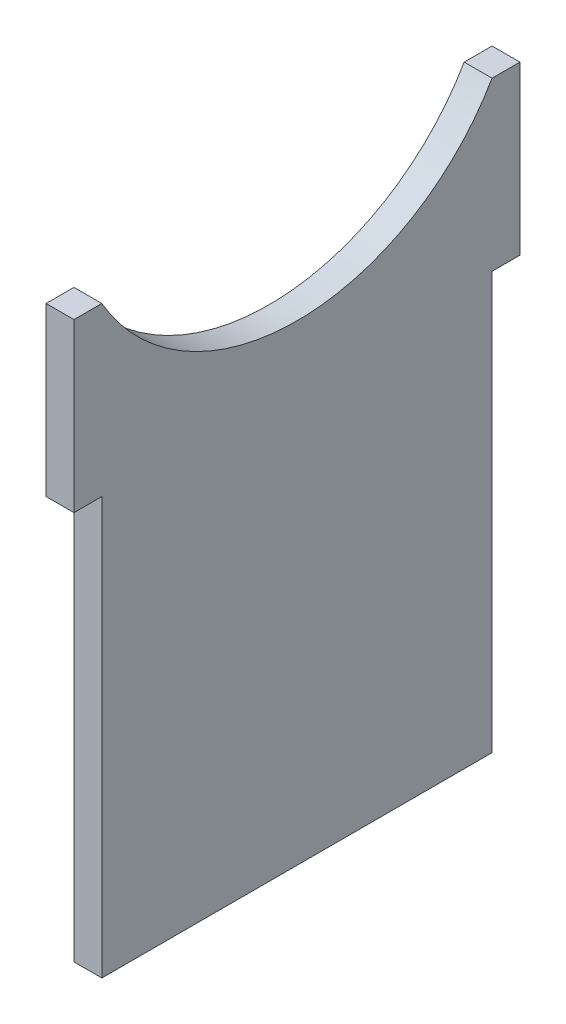
ISO-10303-21;
HEADER;
FILE_DESCRIPTION(('STEP AP214'),'2;1');
FILE_NAME('part.step','',(''),(''),'','','');
FILE_SCHEMA(('AUTOMOTIVE_DESIGN { 1 0 10303 214 1 1 1 1 }'));
ENDSEC;
DATA;
#1=APPLICATION_CONTEXT('core data for automotive mechanical design processes');
#2=APPLICATION_PROTOCOL_DEFINITION('international standard','automotive_design',2000,#1);
#3=PRODUCT_CONTEXT('',#1,'mechanical');
#4=PRODUCT('Part','Part','',(#3));
#5=PRODUCT_RELATED_PRODUCT_CATEGORY('part','',(#4));
#6=PRODUCT_DEFINITION_FORMATION('','',#4);
#7=PRODUCT_DEFINITION_CONTEXT('part definition',#1,'design');
#8=PRODUCT_DEFINITION('design','',#6,#7);
#9=PRODUCT_DEFINITION_SHAPE('','',#8);
#10=(LENGTH_UNIT() NAMED_UNIT(*) SI_UNIT(.MILLI.,.METRE.));
#11=(NAMED_UNIT(*) PLANE_ANGLE_UNIT() SI_UNIT($,.RADIAN.));
#12=(NAMED_UNIT(*) SI_UNIT($,.STERADIAN.) SOLID_ANGLE_UNIT());
#13=UNCERTAINTY_MEASURE_WITH_UNIT(LENGTH_MEASURE(1.E-05),#10,'distance_accuracy_value','');
#14=(GEOMETRIC_REPRESENTATION_CONTEXT(3) GLOBAL_UNCERTAINTY_ASSIGNED_CONTEXT((#13)) GLOBAL_UNIT_ASSIGNED_CONTEXT((#10,
#11,#12)) REPRESENTATION_CONTEXT('',''));
#15=CARTESIAN_POINT('',(0.,0.,0.));
#16=DIRECTION('',(0.,0.,1.));
#17=DIRECTION('',(1.,0.,0.));
#18=AXIS2_PLACEMENT_3D('',#15,#16,#17);
#19=CARTESIAN_POINT('',(1.5875,0.,0.));
#20=DIRECTION('',(-1.,0.,0.));
#21=DIRECTION('',(0.,0.,1.));
#22=AXIS2_PLACEMENT_3D('',#19,#20,#21);
#23=CYLINDRICAL_SURFACE('',#22,12.8316097327394);
#24=CARTESIAN_POINT('',(0.,0.,0.));
#25=DIRECTION('',(1.,0.,0.));
#26=DIRECTION('',(0.,0.,-1.));
#27=AXIS2_PLACEMENT_3D('',#24,#25,#26);
#28=CIRCLE('',#27,12.8316097327394);
#29=CARTESIAN_POINT('',(0.,-6.41580486636971,11.1125));
#30=VERTEX_POINT('',#29);
#31=CARTESIAN_POINT('',(0.,-6.41580486636971,-11.1125));
#32=VERTEX_POINT('',#31);
#33=EDGE_CURVE('E142',#30,#32,#28,.T.);
#34=ORIENTED_EDGE('',*,*,#33,.F.);
#35=DIRECTION('',(-1.,0.,0.));
#36=VECTOR('',#35,1.);
#37=CARTESIAN_POINT('',(1.5875,-6.41580486636971,11.1125));
#38=LINE('',#37,#36);
#39=CARTESIAN_POINT('',(1.5875,-6.41580486636971,11.1125));
#40=VERTEX_POINT('',#39);
#41=EDGE_CURVE('E11',#40,#30,#38,.T.);
#42=ORIENTED_EDGE('',*,*,#41,.F.);
#43=CARTESIAN_POINT('',(1.5875,0.,0.));
#44=DIRECTION('',(1.,0.,0.));
#45=DIRECTION('',(0.,0.,-1.));
#46=AXIS2_PLACEMENT_3D('',#43,#44,#45);
#47=CIRCLE('',#46,12.8316097327394);
#48=CARTESIAN_POINT('',(1.5875,-6.41580486636971,-11.1125));
#49=VERTEX_POINT('',#48);
#50=EDGE_CURVE('E164',#40,#49,#47,.T.);
#51=ORIENTED_EDGE('',*,*,#50,.T.);
#52=DIRECTION('',(-1.,0.,0.));
#53=VECTOR('',#52,1.);
#54=CARTESIAN_POINT('',(1.5875,-6.41580486636971,-11.1125));
#55=LINE('',#54,#53);
#56=EDGE_CURVE('E52',#49,#32,#55,.T.);
#57=ORIENTED_EDGE('',*,*,#56,.T.);
#58=EDGE_LOOP('',(#34,#42,#51,#57));
#59=FACE_BOUND('',#58,.T.);
#60=ADVANCED_FACE('F36',(#59),#23,.F.);
#61=CARTESIAN_POINT('',(1.5875,-6.41580486636971,0.));
#62=DIRECTION('',(0.,-1.,0.));
#63=DIRECTION('',(0.,0.,-1.));
#64=AXIS2_PLACEMENT_3D('',#61,#62,#63);
#65=PLANE('',#64);
#66=DIRECTION('',(0.,0.,1.));
#67=VECTOR('',#66,1.);
#68=CARTESIAN_POINT('',(0.,-6.41580486636971,0.));
#69=LINE('',#68,#67);
#70=CARTESIAN_POINT('',(0.,-6.41580486636971,12.7));
#71=VERTEX_POINT('',#70);
#72=EDGE_CURVE('E144',#30,#71,#69,.T.);
#73=ORIENTED_EDGE('',*,*,#72,.T.);
#74=DIRECTION('',(-1.,0.,0.));
#75=VECTOR('',#74,1.);
#76=CARTESIAN_POINT('',(1.5875,-6.41580486636971,12.7));
#77=LINE('',#76,#75);
#78=CARTESIAN_POINT('',(1.5875,-6.41580486636971,12.7));
#79=VERTEX_POINT('',#78);
#80=EDGE_CURVE('E44',#79,#71,#77,.T.);
#81=ORIENTED_EDGE('',*,*,#80,.F.);
#82=DIRECTION('',(0.,0.,1.));
#83=VECTOR('',#82,1.);
#84=CARTESIAN_POINT('',(1.5875,-6.41580486636971,0.));
#85=LINE('',#84,#83);
#86=EDGE_CURVE('E202',#40,#79,#85,.T.);
#87=ORIENTED_EDGE('',*,*,#86,.F.);
#88=ORIENTED_EDGE('',*,*,#41,.T.);
#89=EDGE_LOOP('',(#73,#81,#87,#88));
#90=FACE_BOUND('',#89,.T.);
#91=ADVANCED_FACE('F225',(#90),#65,.F.);
#92=CARTESIAN_POINT('',(1.5875,0.,12.7));
#93=DIRECTION('',(0.,0.,-1.));
#94=DIRECTION('',(0.,1.,0.));
#95=AXIS2_PLACEMENT_3D('',#92,#93,#94);
#96=PLANE('',#95);
#97=DIRECTION('',(0.,-1.,0.));
#98=VECTOR('',#97,1.);
#99=CARTESIAN_POINT('',(0.,0.,12.7));
#100=LINE('',#99,#98);
#101=CARTESIAN_POINT('',(0.,-15.9408048663697,12.7));
#102=VERTEX_POINT('',#101);
#103=EDGE_CURVE('E146',#71,#102,#100,.T.);
#104=ORIENTED_EDGE('',*,*,#103,.T.);
#105=DIRECTION('',(-1.,0.,0.));
#106=VECTOR('',#105,1.);
#107=CARTESIAN_POINT('',(1.5875,-15.9408048663697,12.7));
#108=LINE('',#107,#106);
#109=CARTESIAN_POINT('',(1.5875,-15.9408048663697,12.7));
#110=VERTEX_POINT('',#109);
#111=EDGE_CURVE('E176',#110,#102,#108,.T.);
#112=ORIENTED_EDGE('',*,*,#111,.F.);
#113=DIRECTION('',(0.,-1.,0.));
#114=VECTOR('',#113,1.);
#115=CARTESIAN_POINT('',(1.5875,0.,12.7));
#116=LINE('',#115,#114);
#117=EDGE_CURVE('E184',#79,#110,#116,.T.);
#118=ORIENTED_EDGE('',*,*,#117,.F.);
#119=ORIENTED_EDGE('',*,*,#80,.T.);
#120=EDGE_LOOP('',(#104,#112,#118,#119));
#121=FACE_BOUND('',#120,.T.);
#122=ADVANCED_FACE('F182',(#121),#96,.F.);
#123=CARTESIAN_POINT('',(1.5875,-15.9408048663697,0.));
#124=DIRECTION('',(0.,-1.,0.));
#125=DIRECTION('',(0.,0.,-1.));
#126=AXIS2_PLACEMENT_3D('',#123,#124,#125);
#127=PLANE('',#126);
#128=DIRECTION('',(0.,0.,1.));
#129=VECTOR('',#128,1.);
#130=CARTESIAN_POINT('',(0.,-15.9408048663697,0.));
#131=LINE('',#130,#129);
#132=CARTESIAN_POINT('',(0.,-15.9408048663697,11.1125));
#133=VERTEX_POINT('',#132);
#134=EDGE_CURVE('E149',#133,#102,#131,.T.);
#135=ORIENTED_EDGE('',*,*,#134,.F.);
#136=DIRECTION('',(-1.,0.,0.));
#137=VECTOR('',#136,1.);
#138=CARTESIAN_POINT('',(1.5875,-15.9408048663697,11.1125));
#139=LINE('',#138,#137);
#140=CARTESIAN_POINT('',(1.5875,-15.9408048663697,11.1125));
#141=VERTEX_POINT('',#140);
#142=EDGE_CURVE('E174',#141,#133,#139,.T.);
#143=ORIENTED_EDGE('',*,*,#142,.F.);
#144=DIRECTION('',(0.,0.,1.));
#145=VECTOR('',#144,1.);
#146=CARTESIAN_POINT('',(1.5875,-15.9408048663697,0.));
#147=LINE('',#146,#145);
#148=EDGE_CURVE('E197',#141,#110,#147,.T.);
#149=ORIENTED_EDGE('',*,*,#148,.T.);
#150=ORIENTED_EDGE('',*,*,#111,.T.);
#151=EDGE_LOOP('',(#135,#143,#149,#150));
#152=FACE_BOUND('',#151,.T.);
#153=ADVANCED_FACE('F193',(#152),#127,.T.);
#154=CARTESIAN_POINT('',(1.5875,0.,11.1125));
#155=DIRECTION('',(0.,0.,-1.));
#156=DIRECTION('',(0.,1.,0.));
#157=AXIS2_PLACEMENT_3D('',#154,#155,#156);
#158=PLANE('',#157);
#159=DIRECTION('',(0.,-1.,0.));
#160=VECTOR('',#159,1.);
#161=CARTESIAN_POINT('',(0.,0.,11.1125));
#162=LINE('',#161,#160);
#163=CARTESIAN_POINT('',(0.,-39.6875,11.1125));
#164=VERTEX_POINT('',#163);
#165=EDGE_CURVE('E152',#133,#164,#162,.T.);
#166=ORIENTED_EDGE('',*,*,#165,.T.);
#167=DIRECTION('',(-1.,0.,0.));
#168=VECTOR('',#167,1.);
#169=CARTESIAN_POINT('',(1.5875,-39.6875,11.1125));
#170=LINE('',#169,#168);
#171=CARTESIAN_POINT('',(1.5875,-39.6875,11.1125));
#172=VERTEX_POINT('',#171);
#173=EDGE_CURVE('E171',#172,#164,#170,.T.);
#174=ORIENTED_EDGE('',*,*,#173,.F.);
#175=DIRECTION('',(0.,-1.,0.));
#176=VECTOR('',#175,1.);
#177=CARTESIAN_POINT('',(1.5875,0.,11.1125));
#178=LINE('',#177,#176);
#179=EDGE_CURVE('E198',#141,#172,#178,.T.);
#180=ORIENTED_EDGE('',*,*,#179,.F.);
#181=ORIENTED_EDGE('',*,*,#142,.T.);
#182=EDGE_LOOP('',(#166,#174,#180,#181));
#183=FACE_BOUND('',#182,.T.);
#184=ADVANCED_FACE('F236',(#183),#158,.F.);
#185=CARTESIAN_POINT('',(1.5875,-39.6875,0.));
#186=DIRECTION('',(0.,1.,0.));
#187=DIRECTION('',(0.,0.,1.));
#188=AXIS2_PLACEMENT_3D('',#185,#186,#187);
#189=PLANE('',#188);
#190=DIRECTION('',(0.,0.,-1.));
#191=VECTOR('',#190,1.);
#192=CARTESIAN_POINT('',(0.,-39.6875,0.));
#193=LINE('',#192,#191);
#194=CARTESIAN_POINT('',(0.,-39.6875,-11.1125));
#195=VERTEX_POINT('',#194);
#196=EDGE_CURVE('E154',#164,#195,#193,.T.);
#197=ORIENTED_EDGE('',*,*,#196,.T.);
#198=DIRECTION('',(-1.,0.,0.));
#199=VECTOR('',#198,1.);
#200=CARTESIAN_POINT('',(1.5875,-39.6875,-11.1125));
#201=LINE('',#200,#199);
#202=CARTESIAN_POINT('',(1.5875,-39.6875,-11.1125));
#203=VERTEX_POINT('',#202);
#204=EDGE_CURVE('E168',#203,#195,#201,.T.);
#205=ORIENTED_EDGE('',*,*,#204,.F.);
#206=DIRECTION('',(0.,0.,-1.));
#207=VECTOR('',#206,1.);
#208=CARTESIAN_POINT('',(1.5875,-39.6875,0.));
#209=LINE('',#208,#207);
#210=EDGE_CURVE('E200',#172,#203,#209,.T.);
#211=ORIENTED_EDGE('',*,*,#210,.F.);
#212=ORIENTED_EDGE('',*,*,#173,.T.);
#213=EDGE_LOOP('',(#197,#205,#211,#212));
#214=FACE_BOUND('',#213,.T.);
#215=ADVANCED_FACE('F210',(#214),#189,.F.);
#216=CARTESIAN_POINT('',(1.5875,0.,-11.1125));
#217=DIRECTION('',(0.,0.,1.));
#218=DIRECTION('',(0.,-1.,0.));
#219=AXIS2_PLACEMENT_3D('',#216,#217,#218);
#220=PLANE('',#219);
#221=DIRECTION('',(0.,1.,0.));
#222=VECTOR('',#221,1.);
#223=CARTESIAN_POINT('',(0.,0.,-11.1125));
#224=LINE('',#223,#222);
#225=CARTESIAN_POINT('',(0.,-15.9408048663697,-11.1125));
#226=VERTEX_POINT('',#225);
#227=EDGE_CURVE('E156',#195,#226,#224,.T.);
#228=ORIENTED_EDGE('',*,*,#227,.T.);
#229=DIRECTION('',(-1.,0.,0.));
#230=VECTOR('',#229,1.);
#231=CARTESIAN_POINT('',(1.5875,-15.9408048663697,-11.1125));
#232=LINE('',#231,#230);
#233=CARTESIAN_POINT('',(1.5875,-15.9408048663697,-11.1125));
#234=VERTEX_POINT('',#233);
#235=EDGE_CURVE('E134',#234,#226,#232,.T.);
#236=ORIENTED_EDGE('',*,*,#235,.F.);
#237=DIRECTION('',(0.,1.,0.));
#238=VECTOR('',#237,1.);
#239=CARTESIAN_POINT('',(1.5875,0.,-11.1125));
#240=LINE('',#239,#238);
#241=EDGE_CURVE('E122',#203,#234,#240,.T.);
#242=ORIENTED_EDGE('',*,*,#241,.F.);
#243=ORIENTED_EDGE('',*,*,#204,.T.);
#244=EDGE_LOOP('',(#228,#236,#242,#243));
#245=FACE_BOUND('',#244,.T.);
#246=ADVANCED_FACE('F213',(#245),#220,.F.);
#247=CARTESIAN_POINT('',(1.5875,-15.9408048663697,0.));
#248=DIRECTION('',(0.,1.,0.));
#249=DIRECTION('',(0.,0.,1.));
#250=AXIS2_PLACEMENT_3D('',#247,#248,#249);
#251=PLANE('',#250);
#252=DIRECTION('',(0.,0.,-1.));
#253=VECTOR('',#252,1.);
#254=CARTESIAN_POINT('',(0.,-15.9408048663697,0.));
#255=LINE('',#254,#253);
#256=CARTESIAN_POINT('',(0.,-15.9408048663697,-12.7));
#257=VERTEX_POINT('',#256);
#258=EDGE_CURVE('E131',#226,#257,#255,.T.);
#259=ORIENTED_EDGE('',*,*,#258,.T.);
#260=DIRECTION('',(-1.,0.,0.));
#261=VECTOR('',#260,1.);
#262=CARTESIAN_POINT('',(1.5875,-15.9408048663697,-12.7));
#263=LINE('',#262,#261);
#264=CARTESIAN_POINT('',(1.5875,-15.9408048663697,-12.7));
#265=VERTEX_POINT('',#264);
#266=EDGE_CURVE('E128',#265,#257,#263,.T.);
#267=ORIENTED_EDGE('',*,*,#266,.F.);
#268=DIRECTION('',(0.,0.,-1.));
#269=VECTOR('',#268,1.);
#270=CARTESIAN_POINT('',(1.5875,-15.9408048663697,0.));
#271=LINE('',#270,#269);
#272=EDGE_CURVE('E114',#234,#265,#271,.T.);
#273=ORIENTED_EDGE('',*,*,#272,.F.);
#274=ORIENTED_EDGE('',*,*,#235,.T.);
#275=EDGE_LOOP('',(#259,#267,#273,#274));
#276=FACE_BOUND('',#275,.T.);
#277=ADVANCED_FACE('F129',(#276),#251,.F.);
#278=CARTESIAN_POINT('',(1.5875,0.,-12.7));
#279=DIRECTION('',(0.,0.,-1.));
#280=DIRECTION('',(0.,1.,0.));
#281=AXIS2_PLACEMENT_3D('',#278,#279,#280);
#282=PLANE('',#281);
#283=DIRECTION('',(0.,-1.,0.));
#284=VECTOR('',#283,1.);
#285=CARTESIAN_POINT('',(0.,0.,-12.7));
#286=LINE('',#285,#284);
#287=CARTESIAN_POINT('',(0.,-6.41580486636971,-12.7));
#288=VERTEX_POINT('',#287);
#289=EDGE_CURVE('E159',#288,#257,#286,.T.);
#290=ORIENTED_EDGE('',*,*,#289,.F.);
#291=DIRECTION('',(-1.,0.,0.));
#292=VECTOR('',#291,1.);
#293=CARTESIAN_POINT('',(1.5875,-6.41580486636971,-12.7));
#294=LINE('',#293,#292);
#295=CARTESIAN_POINT('',(1.5875,-6.41580486636971,-12.7));
#296=VERTEX_POINT('',#295);
#297=EDGE_CURVE('E83',#296,#288,#294,.T.);
#298=ORIENTED_EDGE('',*,*,#297,.F.);
#299=DIRECTION('',(0.,-1.,0.));
#300=VECTOR('',#299,1.);
#301=CARTESIAN_POINT('',(1.5875,0.,-12.7));
#302=LINE('',#301,#300);
#303=EDGE_CURVE('E120',#296,#265,#302,.T.);
#304=ORIENTED_EDGE('',*,*,#303,.T.);
#305=ORIENTED_EDGE('',*,*,#266,.T.);
#306=EDGE_LOOP('',(#290,#298,#304,#305));
#307=FACE_BOUND('',#306,.T.);
#308=ADVANCED_FACE('F136',(#307),#282,.T.);
#309=CARTESIAN_POINT('',(1.5875,-6.41580486636971,0.));
#310=DIRECTION('',(0.,1.,0.));
#311=DIRECTION('',(0.,0.,1.));
#312=AXIS2_PLACEMENT_3D('',#309,#310,#311);
#313=PLANE('',#312);
#314=DIRECTION('',(0.,0.,-1.));
#315=VECTOR('',#314,1.);
#316=CARTESIAN_POINT('',(0.,-6.41580486636971,0.));
#317=LINE('',#316,#315);
#318=EDGE_CURVE('E161',#32,#288,#317,.T.);
#319=ORIENTED_EDGE('',*,*,#318,.F.);
#320=ORIENTED_EDGE('',*,*,#56,.F.);
#321=DIRECTION('',(0.,0.,-1.));
#322=VECTOR('',#321,1.);
#323=CARTESIAN_POINT('',(1.5875,-6.41580486636971,0.));
#324=LINE('',#323,#322);
#325=EDGE_CURVE('E137',#49,#296,#324,.T.);
#326=ORIENTED_EDGE('',*,*,#325,.T.);
#327=ORIENTED_EDGE('',*,*,#297,.T.);
#328=EDGE_LOOP('',(#319,#320,#326,#327));
#329=FACE_BOUND('',#328,.T.);
#330=ADVANCED_FACE('F214',(#329),#313,.T.);
#331=CARTESIAN_POINT('',(1.5875,0.,0.));
#332=DIRECTION('',(1.,0.,0.));
#333=DIRECTION('',(0.,0.,-1.));
#334=AXIS2_PLACEMENT_3D('',#331,#332,#333);
#335=PLANE('',#334);
#336=ORIENTED_EDGE('',*,*,#50,.F.);
#337=ORIENTED_EDGE('',*,*,#86,.T.);
#338=ORIENTED_EDGE('',*,*,#117,.T.);
#339=ORIENTED_EDGE('',*,*,#148,.F.);
#340=ORIENTED_EDGE('',*,*,#179,.T.);
#341=ORIENTED_EDGE('',*,*,#210,.T.);
#342=ORIENTED_EDGE('',*,*,#241,.T.);
#343=ORIENTED_EDGE('',*,*,#272,.T.);
#344=ORIENTED_EDGE('',*,*,#303,.F.);
#345=ORIENTED_EDGE('',*,*,#325,.F.);
#346=EDGE_LOOP('',(#336,#337,#338,#339,#340,#341,#342,#343,#344,#345));
#347=FACE_BOUND('',#346,.T.);
#348=ADVANCED_FACE('F117',(#347),#335,.T.);
#349=CARTESIAN_POINT('',(0.,0.,0.));
#350=DIRECTION('',(1.,0.,0.));
#351=DIRECTION('',(0.,0.,-1.));
#352=AXIS2_PLACEMENT_3D('',#349,#350,#351);
#353=PLANE('',#352);
#354=ORIENTED_EDGE('',*,*,#33,.T.);
#355=ORIENTED_EDGE('',*,*,#318,.T.);
#356=ORIENTED_EDGE('',*,*,#289,.T.);
#357=ORIENTED_EDGE('',*,*,#258,.F.);
#358=ORIENTED_EDGE('',*,*,#227,.F.);
#359=ORIENTED_EDGE('',*,*,#196,.F.);
#360=ORIENTED_EDGE('',*,*,#165,.F.);
#361=ORIENTED_EDGE('',*,*,#134,.T.);
#362=ORIENTED_EDGE('',*,*,#103,.F.);
#363=ORIENTED_EDGE('',*,*,#72,.F.);
#364=EDGE_LOOP('',(#354,#355,#356,#357,#358,#359,#360,#361,#362,#363));
#365=FACE_BOUND('',#364,.T.);
#366=ADVANCED_FACE('F188',(#365),#353,.F.);
#367=CLOSED_SHELL('',(#60,#91,#122,#153,#184,#215,#246,#277,#308,#330,#348,#366));
#368=MANIFOLD_SOLID_BREP('B2',#367);
#369=ADVANCED_BREP_SHAPE_REPRESENTATION('',(#18,#368),#14);
#370=SHAPE_DEFINITION_REPRESENTATION(#9,#369);
ENDSEC;
END-ISO-10303-21;
